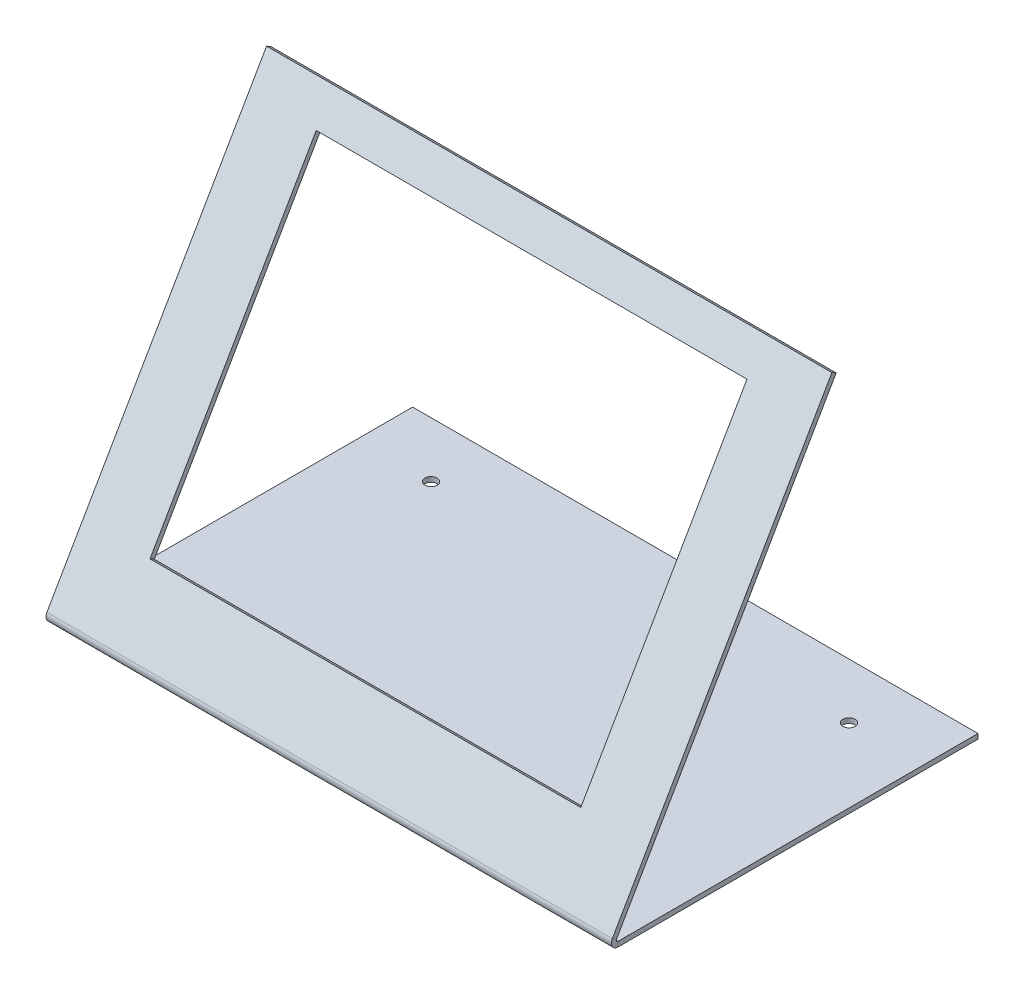
ISO-10303-21;
HEADER;
FILE_DESCRIPTION(('STEP AP214'),'2;1');
FILE_NAME('part.step','',(''),(''),'','','');
FILE_SCHEMA(('AUTOMOTIVE_DESIGN { 1 0 10303 214 1 1 1 1 }'));
ENDSEC;
DATA;
#1=APPLICATION_CONTEXT('core data for automotive mechanical design processes');
#2=APPLICATION_PROTOCOL_DEFINITION('international standard','automotive_design',2000,#1);
#3=PRODUCT_CONTEXT('',#1,'mechanical');
#4=PRODUCT('Part','Part','',(#3));
#5=PRODUCT_RELATED_PRODUCT_CATEGORY('part','',(#4));
#6=PRODUCT_DEFINITION_FORMATION('','',#4);
#7=PRODUCT_DEFINITION_CONTEXT('part definition',#1,'design');
#8=PRODUCT_DEFINITION('design','',#6,#7);
#9=PRODUCT_DEFINITION_SHAPE('','',#8);
#10=(LENGTH_UNIT() NAMED_UNIT(*) SI_UNIT(.MILLI.,.METRE.));
#11=(NAMED_UNIT(*) PLANE_ANGLE_UNIT() SI_UNIT($,.RADIAN.));
#12=(NAMED_UNIT(*) SI_UNIT($,.STERADIAN.) SOLID_ANGLE_UNIT());
#13=UNCERTAINTY_MEASURE_WITH_UNIT(LENGTH_MEASURE(1.E-05),#10,'distance_accuracy_value','');
#14=(GEOMETRIC_REPRESENTATION_CONTEXT(3) GLOBAL_UNCERTAINTY_ASSIGNED_CONTEXT((#13)) GLOBAL_UNIT_ASSIGNED_CONTEXT((#10,
#11,#12)) REPRESENTATION_CONTEXT('',''));
#15=CARTESIAN_POINT('',(0.,0.,0.));
#16=DIRECTION('',(0.,0.,1.));
#17=DIRECTION('',(1.,0.,0.));
#18=AXIS2_PLACEMENT_3D('',#15,#16,#17);
#19=CARTESIAN_POINT('',(230.,-2.,0.));
#20=DIRECTION('',(1.,0.,0.));
#21=DIRECTION('',(0.,0.,-1.));
#22=AXIS2_PLACEMENT_3D('',#19,#20,#21);
#23=PLANE('',#22);
#24=DIRECTION('',(0.,0.,-1.));
#25=VECTOR('',#24,1.);
#26=CARTESIAN_POINT('',(230.,0.,0.));
#27=LINE('',#26,#25);
#28=CARTESIAN_POINT('',(230.,0.,146.414770298386));
#29=VERTEX_POINT('',#28);
#30=CARTESIAN_POINT('',(230.,0.,0.));
#31=VERTEX_POINT('',#30);
#32=EDGE_CURVE('E324',#29,#31,#27,.T.);
#33=ORIENTED_EDGE('',*,*,#32,.F.);
#34=DIRECTION('',(0.,-1.,0.));
#35=VECTOR('',#34,1.);
#36=CARTESIAN_POINT('',(230.,0.,146.414770298386));
#37=LINE('',#36,#35);
#38=CARTESIAN_POINT('',(230.,-2.,146.414770298386));
#39=VERTEX_POINT('',#38);
#40=EDGE_CURVE('E254',#29,#39,#37,.T.);
#41=ORIENTED_EDGE('',*,*,#40,.T.);
#42=DIRECTION('',(0.,0.,-1.));
#43=VECTOR('',#42,1.);
#44=CARTESIAN_POINT('',(230.,-2.,0.));
#45=LINE('',#44,#43);
#46=CARTESIAN_POINT('',(230.,-2.,0.));
#47=VERTEX_POINT('',#46);
#48=EDGE_CURVE('E313',#39,#47,#45,.T.);
#49=ORIENTED_EDGE('',*,*,#48,.T.);
#50=DIRECTION('',(0.,1.,0.));
#51=VECTOR('',#50,1.);
#52=CARTESIAN_POINT('',(230.,-2.,0.));
#53=LINE('',#52,#51);
#54=EDGE_CURVE('E69',#47,#31,#53,.T.);
#55=ORIENTED_EDGE('',*,*,#54,.T.);
#56=EDGE_LOOP('',(#33,#41,#49,#55));
#57=FACE_BOUND('',#56,.T.);
#58=ADVANCED_FACE('F65',(#57),#23,.T.);
#59=CARTESIAN_POINT('',(0.,-2.,0.));
#60=DIRECTION('',(0.,1.,0.));
#61=DIRECTION('',(0.,0.,1.));
#62=AXIS2_PLACEMENT_3D('',#59,#60,#61);
#63=PLANE('',#62);
#64=CARTESIAN_POINT('',(30.,-2.,22.5));
#65=DIRECTION('',(0.,1.,0.));
#66=DIRECTION('',(0.,0.,1.));
#67=AXIS2_PLACEMENT_3D('',#64,#65,#66);
#68=CIRCLE('',#67,2.5);
#69=CARTESIAN_POINT('',(30.,-2.,25.));
#70=VERTEX_POINT('',#69);
#71=EDGE_CURVE('E301',#70,#70,#68,.T.);
#72=ORIENTED_EDGE('',*,*,#71,.T.);
#73=EDGE_LOOP('',(#72));
#74=FACE_BOUND('',#73,.T.);
#75=CARTESIAN_POINT('',(30.,-2.,127.5));
#76=DIRECTION('',(0.,1.,0.));
#77=DIRECTION('',(0.,0.,1.));
#78=AXIS2_PLACEMENT_3D('',#75,#76,#77);
#79=CIRCLE('',#78,2.5);
#80=CARTESIAN_POINT('',(30.,-2.,130.));
#81=VERTEX_POINT('',#80);
#82=EDGE_CURVE('E293',#81,#81,#79,.T.);
#83=ORIENTED_EDGE('',*,*,#82,.T.);
#84=EDGE_LOOP('',(#83));
#85=FACE_BOUND('',#84,.T.);
#86=CARTESIAN_POINT('',(200.,-2.,127.5));
#87=DIRECTION('',(0.,1.,0.));
#88=DIRECTION('',(0.,0.,1.));
#89=AXIS2_PLACEMENT_3D('',#86,#87,#88);
#90=CIRCLE('',#89,2.5);
#91=CARTESIAN_POINT('',(200.,-2.,130.));
#92=VERTEX_POINT('',#91);
#93=EDGE_CURVE('E285',#92,#92,#90,.T.);
#94=ORIENTED_EDGE('',*,*,#93,.T.);
#95=EDGE_LOOP('',(#94));
#96=FACE_BOUND('',#95,.T.);
#97=CARTESIAN_POINT('',(200.,-2.,22.5));
#98=DIRECTION('',(0.,1.,0.));
#99=DIRECTION('',(0.,0.,1.));
#100=AXIS2_PLACEMENT_3D('',#97,#98,#99);
#101=CIRCLE('',#100,2.5);
#102=CARTESIAN_POINT('',(200.,-2.,25.));
#103=VERTEX_POINT('',#102);
#104=EDGE_CURVE('E277',#103,#103,#101,.T.);
#105=ORIENTED_EDGE('',*,*,#104,.T.);
#106=EDGE_LOOP('',(#105));
#107=FACE_BOUND('',#106,.T.);
#108=DIRECTION('',(1.,0.,0.));
#109=VECTOR('',#108,1.);
#110=CARTESIAN_POINT('',(230.,-2.,146.414770298386));
#111=LINE('',#110,#109);
#112=CARTESIAN_POINT('',(0.,-2.,146.414770298386));
#113=VERTEX_POINT('',#112);
#114=EDGE_CURVE('E246',#39,#113,#111,.F.);
#115=ORIENTED_EDGE('',*,*,#114,.T.);
#116=DIRECTION('',(0.,0.,1.));
#117=VECTOR('',#116,1.);
#118=CARTESIAN_POINT('',(0.,-2.,0.));
#119=LINE('',#118,#117);
#120=CARTESIAN_POINT('',(0.,-2.,0.));
#121=VERTEX_POINT('',#120);
#122=EDGE_CURVE('E309',#121,#113,#119,.T.);
#123=ORIENTED_EDGE('',*,*,#122,.F.);
#124=DIRECTION('',(-1.,0.,0.));
#125=VECTOR('',#124,1.);
#126=CARTESIAN_POINT('',(0.,-2.,0.));
#127=LINE('',#126,#125);
#128=EDGE_CURVE('E317',#47,#121,#127,.T.);
#129=ORIENTED_EDGE('',*,*,#128,.F.);
#130=ORIENTED_EDGE('',*,*,#48,.F.);
#131=EDGE_LOOP('',(#115,#123,#129,#130));
#132=FACE_BOUND('',#131,.T.);
#133=ADVANCED_FACE('F383',(#74,#85,#96,#107,#132),#63,.F.);
#134=CARTESIAN_POINT('',(0.,0.,0.));
#135=DIRECTION('',(0.,1.,0.));
#136=DIRECTION('',(0.,0.,1.));
#137=AXIS2_PLACEMENT_3D('',#134,#135,#136);
#138=PLANE('',#137);
#139=CARTESIAN_POINT('',(200.,0.,22.5));
#140=DIRECTION('',(0.,1.,0.));
#141=DIRECTION('',(0.,0.,1.));
#142=AXIS2_PLACEMENT_3D('',#139,#140,#141);
#143=CIRCLE('',#142,2.5);
#144=CARTESIAN_POINT('',(200.,0.,25.));
#145=VERTEX_POINT('',#144);
#146=EDGE_CURVE('E273',#145,#145,#143,.T.);
#147=ORIENTED_EDGE('',*,*,#146,.F.);
#148=EDGE_LOOP('',(#147));
#149=FACE_BOUND('',#148,.T.);
#150=CARTESIAN_POINT('',(200.,0.,127.5));
#151=DIRECTION('',(0.,1.,0.));
#152=DIRECTION('',(0.,0.,1.));
#153=AXIS2_PLACEMENT_3D('',#150,#151,#152);
#154=CIRCLE('',#153,2.5);
#155=CARTESIAN_POINT('',(200.,0.,130.));
#156=VERTEX_POINT('',#155);
#157=EDGE_CURVE('E281',#156,#156,#154,.T.);
#158=ORIENTED_EDGE('',*,*,#157,.F.);
#159=EDGE_LOOP('',(#158));
#160=FACE_BOUND('',#159,.T.);
#161=CARTESIAN_POINT('',(30.,0.,127.5));
#162=DIRECTION('',(0.,1.,0.));
#163=DIRECTION('',(0.,0.,1.));
#164=AXIS2_PLACEMENT_3D('',#161,#162,#163);
#165=CIRCLE('',#164,2.5);
#166=CARTESIAN_POINT('',(30.,0.,130.));
#167=VERTEX_POINT('',#166);
#168=EDGE_CURVE('E289',#167,#167,#165,.T.);
#169=ORIENTED_EDGE('',*,*,#168,.F.);
#170=EDGE_LOOP('',(#169));
#171=FACE_BOUND('',#170,.T.);
#172=CARTESIAN_POINT('',(30.,0.,22.5));
#173=DIRECTION('',(0.,1.,0.));
#174=DIRECTION('',(0.,0.,1.));
#175=AXIS2_PLACEMENT_3D('',#172,#173,#174);
#176=CIRCLE('',#175,2.5);
#177=CARTESIAN_POINT('',(30.,0.,25.));
#178=VERTEX_POINT('',#177);
#179=EDGE_CURVE('E297',#178,#178,#176,.T.);
#180=ORIENTED_EDGE('',*,*,#179,.F.);
#181=EDGE_LOOP('',(#180));
#182=FACE_BOUND('',#181,.T.);
#183=DIRECTION('',(0.,0.,1.));
#184=VECTOR('',#183,1.);
#185=CARTESIAN_POINT('',(0.,0.,0.));
#186=LINE('',#185,#184);
#187=CARTESIAN_POINT('',(0.,0.,0.));
#188=VERTEX_POINT('',#187);
#189=CARTESIAN_POINT('',(0.,0.,146.414770298386));
#190=VERTEX_POINT('',#189);
#191=EDGE_CURVE('E305',#188,#190,#186,.T.);
#192=ORIENTED_EDGE('',*,*,#191,.T.);
#193=DIRECTION('',(1.,0.,0.));
#194=VECTOR('',#193,1.);
#195=CARTESIAN_POINT('',(230.,0.,146.414770298386));
#196=LINE('',#195,#194);
#197=EDGE_CURVE('E262',#29,#190,#196,.F.);
#198=ORIENTED_EDGE('',*,*,#197,.F.);
#199=ORIENTED_EDGE('',*,*,#32,.T.);
#200=DIRECTION('',(-1.,0.,0.));
#201=VECTOR('',#200,1.);
#202=CARTESIAN_POINT('',(0.,0.,0.));
#203=LINE('',#202,#201);
#204=EDGE_CURVE('E314',#31,#188,#203,.T.);
#205=ORIENTED_EDGE('',*,*,#204,.T.);
#206=EDGE_LOOP('',(#192,#198,#199,#205));
#207=FACE_BOUND('',#206,.T.);
#208=ADVANCED_FACE('F333',(#149,#160,#171,#182,#207),#138,.T.);
#209=CARTESIAN_POINT('',(0.,-2.,0.));
#210=DIRECTION('',(-1.,0.,0.));
#211=DIRECTION('',(0.,0.,1.));
#212=AXIS2_PLACEMENT_3D('',#209,#210,#211);
#213=PLANE('',#212);
#214=DIRECTION('',(0.,-1.,0.));
#215=VECTOR('',#214,1.);
#216=CARTESIAN_POINT('',(0.,0.,146.414770298386));
#217=LINE('',#216,#215);
#218=EDGE_CURVE('E269',#190,#113,#217,.T.);
#219=ORIENTED_EDGE('',*,*,#218,.F.);
#220=ORIENTED_EDGE('',*,*,#191,.F.);
#221=DIRECTION('',(0.,1.,0.));
#222=VECTOR('',#221,1.);
#223=CARTESIAN_POINT('',(0.,-2.,0.));
#224=LINE('',#223,#222);
#225=EDGE_CURVE('E13',#121,#188,#224,.T.);
#226=ORIENTED_EDGE('',*,*,#225,.F.);
#227=ORIENTED_EDGE('',*,*,#122,.T.);
#228=EDGE_LOOP('',(#219,#220,#226,#227));
#229=FACE_BOUND('',#228,.T.);
#230=ADVANCED_FACE('F67',(#229),#213,.T.);
#231=CARTESIAN_POINT('',(0.,-2.,0.));
#232=DIRECTION('',(0.,0.,-1.));
#233=DIRECTION('',(-1.,0.,0.));
#234=AXIS2_PLACEMENT_3D('',#231,#232,#233);
#235=PLANE('',#234);
#236=ORIENTED_EDGE('',*,*,#204,.F.);
#237=ORIENTED_EDGE('',*,*,#54,.F.);
#238=ORIENTED_EDGE('',*,*,#128,.T.);
#239=ORIENTED_EDGE('',*,*,#225,.T.);
#240=EDGE_LOOP('',(#236,#237,#238,#239));
#241=FACE_BOUND('',#240,.T.);
#242=ADVANCED_FACE('F339',(#241),#235,.T.);
#243=CARTESIAN_POINT('',(30.,-2.,22.5));
#244=DIRECTION('',(0.,1.,0.));
#245=DIRECTION('',(0.,0.,1.));
#246=AXIS2_PLACEMENT_3D('',#243,#244,#245);
#247=CYLINDRICAL_SURFACE('',#246,2.5);
#248=ORIENTED_EDGE('',*,*,#71,.F.);
#249=EDGE_LOOP('',(#248));
#250=FACE_BOUND('',#249,.T.);
#251=ORIENTED_EDGE('',*,*,#179,.T.);
#252=EDGE_LOOP('',(#251));
#253=FACE_BOUND('',#252,.T.);
#254=ADVANCED_FACE('F393',(#250,#253),#247,.F.);
#255=CARTESIAN_POINT('',(30.,-2.,127.5));
#256=DIRECTION('',(0.,1.,0.));
#257=DIRECTION('',(0.,0.,1.));
#258=AXIS2_PLACEMENT_3D('',#255,#256,#257);
#259=CYLINDRICAL_SURFACE('',#258,2.5);
#260=ORIENTED_EDGE('',*,*,#82,.F.);
#261=EDGE_LOOP('',(#260));
#262=FACE_BOUND('',#261,.T.);
#263=ORIENTED_EDGE('',*,*,#168,.T.);
#264=EDGE_LOOP('',(#263));
#265=FACE_BOUND('',#264,.T.);
#266=ADVANCED_FACE('F399',(#262,#265),#259,.F.);
#267=CARTESIAN_POINT('',(200.,-2.,127.5));
#268=DIRECTION('',(0.,1.,0.));
#269=DIRECTION('',(0.,0.,1.));
#270=AXIS2_PLACEMENT_3D('',#267,#268,#269);
#271=CYLINDRICAL_SURFACE('',#270,2.5);
#272=ORIENTED_EDGE('',*,*,#93,.F.);
#273=EDGE_LOOP('',(#272));
#274=FACE_BOUND('',#273,.T.);
#275=ORIENTED_EDGE('',*,*,#157,.T.);
#276=EDGE_LOOP('',(#275));
#277=FACE_BOUND('',#276,.T.);
#278=ADVANCED_FACE('F403',(#274,#277),#271,.F.);
#279=CARTESIAN_POINT('',(200.,-2.,22.5));
#280=DIRECTION('',(0.,1.,0.));
#281=DIRECTION('',(0.,0.,1.));
#282=AXIS2_PLACEMENT_3D('',#279,#280,#281);
#283=CYLINDRICAL_SURFACE('',#282,2.5);
#284=ORIENTED_EDGE('',*,*,#104,.F.);
#285=EDGE_LOOP('',(#284));
#286=FACE_BOUND('',#285,.T.);
#287=ORIENTED_EDGE('',*,*,#146,.T.);
#288=EDGE_LOOP('',(#287));
#289=FACE_BOUND('',#288,.T.);
#290=ADVANCED_FACE('F407',(#286,#289),#283,.F.);
#291=CARTESIAN_POINT('',(0.,0.736600000000015,146.414770298386));
#292=DIRECTION('',(-1.,0.,0.));
#293=DIRECTION('',(0.,0.,1.));
#294=AXIS2_PLACEMENT_3D('',#291,#292,#293);
#295=PLANE('',#294);
#296=DIRECTION('',(0.,-0.499999999999998,-0.86602540378444));
#297=VECTOR('',#296,1.);
#298=CARTESIAN_POINT('',(0.,2.10490000000001,148.784735418383));
#299=LINE('',#298,#297);
#300=CARTESIAN_POINT('',(0.,1.10490000000002,147.052684610814));
#301=VERTEX_POINT('',#300);
#302=CARTESIAN_POINT('',(0.,2.10490000000002,148.784735418383));
#303=VERTEX_POINT('',#302);
#304=EDGE_CURVE('E203',#301,#303,#299,.F.);
#305=ORIENTED_EDGE('',*,*,#304,.F.);
#306=CARTESIAN_POINT('',(0.,0.736600000000015,146.414770298386));
#307=DIRECTION('',(1.,0.,0.));
#308=DIRECTION('',(0.,0.,-1.));
#309=AXIS2_PLACEMENT_3D('',#306,#307,#308);
#310=CIRCLE('',#309,0.736600000000015);
#311=EDGE_CURVE('E258',#190,#301,#310,.F.);
#312=ORIENTED_EDGE('',*,*,#311,.F.);
#313=ORIENTED_EDGE('',*,*,#218,.T.);
#314=CARTESIAN_POINT('',(0.,0.736600000000015,146.414770298386));
#315=DIRECTION('',(1.,0.,0.));
#316=DIRECTION('',(0.,0.,-1.));
#317=AXIS2_PLACEMENT_3D('',#314,#315,#316);
#318=CIRCLE('',#317,2.73660000000001);
#319=EDGE_CURVE('E249',#113,#303,#318,.F.);
#320=ORIENTED_EDGE('',*,*,#319,.T.);
#321=EDGE_LOOP('',(#305,#312,#313,#320));
#322=FACE_BOUND('',#321,.T.);
#323=ADVANCED_FACE('F346',(#322),#295,.T.);
#324=CARTESIAN_POINT('',(230.,0.736600000000015,146.414770298386));
#325=DIRECTION('',(-1.,0.,0.));
#326=DIRECTION('',(0.,0.,1.));
#327=AXIS2_PLACEMENT_3D('',#324,#325,#326);
#328=PLANE('',#327);
#329=CARTESIAN_POINT('',(230.,0.736600000000015,146.414770298386));
#330=DIRECTION('',(1.,0.,0.));
#331=DIRECTION('',(0.,0.,-1.));
#332=AXIS2_PLACEMENT_3D('',#329,#330,#331);
#333=CIRCLE('',#332,0.736600000000015);
#334=CARTESIAN_POINT('',(230.,1.10490000000002,147.052684610814));
#335=VERTEX_POINT('',#334);
#336=EDGE_CURVE('E208',#335,#29,#333,.T.);
#337=ORIENTED_EDGE('',*,*,#336,.F.);
#338=DIRECTION('',(0.,-0.499999999999998,-0.86602540378444));
#339=VECTOR('',#338,1.);
#340=CARTESIAN_POINT('',(230.,1.10490000000002,147.052684610814));
#341=LINE('',#340,#339);
#342=CARTESIAN_POINT('',(230.,2.10490000000002,148.784735418383));
#343=VERTEX_POINT('',#342);
#344=EDGE_CURVE('E236',#335,#343,#341,.F.);
#345=ORIENTED_EDGE('',*,*,#344,.T.);
#346=CARTESIAN_POINT('',(230.,0.736600000000015,146.414770298386));
#347=DIRECTION('',(1.,0.,0.));
#348=DIRECTION('',(0.,0.,-1.));
#349=AXIS2_PLACEMENT_3D('',#346,#347,#348);
#350=CIRCLE('',#349,2.73660000000001);
#351=EDGE_CURVE('E250',#343,#39,#350,.T.);
#352=ORIENTED_EDGE('',*,*,#351,.T.);
#353=ORIENTED_EDGE('',*,*,#40,.F.);
#354=EDGE_LOOP('',(#337,#345,#352,#353));
#355=FACE_BOUND('',#354,.T.);
#356=ADVANCED_FACE('F412',(#355),#328,.F.);
#357=CARTESIAN_POINT('',(230.,0.736600000000015,146.414770298386));
#358=DIRECTION('',(1.,0.,0.));
#359=DIRECTION('',(0.,0.499999999999998,0.86602540378444));
#360=AXIS2_PLACEMENT_3D('',#357,#358,#359);
#361=CYLINDRICAL_SURFACE('',#360,2.73660000000001);
#362=ORIENTED_EDGE('',*,*,#114,.F.);
#363=ORIENTED_EDGE('',*,*,#351,.F.);
#364=DIRECTION('',(1.,0.,0.));
#365=VECTOR('',#364,1.);
#366=CARTESIAN_POINT('',(0.,2.10490000000003,148.784735418383));
#367=LINE('',#366,#365);
#368=EDGE_CURVE('E233',#343,#303,#367,.F.);
#369=ORIENTED_EDGE('',*,*,#368,.T.);
#370=ORIENTED_EDGE('',*,*,#319,.F.);
#371=EDGE_LOOP('',(#362,#363,#369,#370));
#372=FACE_BOUND('',#371,.T.);
#373=ADVANCED_FACE('F349',(#372),#361,.T.);
#374=CARTESIAN_POINT('',(230.,0.736600000000015,146.414770298386));
#375=DIRECTION('',(1.,0.,0.));
#376=DIRECTION('',(0.,0.499999999999998,0.86602540378444));
#377=AXIS2_PLACEMENT_3D('',#374,#375,#376);
#378=CYLINDRICAL_SURFACE('',#377,0.736600000000015);
#379=ORIENTED_EDGE('',*,*,#197,.T.);
#380=ORIENTED_EDGE('',*,*,#311,.T.);
#381=DIRECTION('',(1.,0.,0.));
#382=VECTOR('',#381,1.);
#383=CARTESIAN_POINT('',(0.,1.10490000000002,147.052684610814));
#384=LINE('',#383,#382);
#385=EDGE_CURVE('E240',#301,#335,#384,.T.);
#386=ORIENTED_EDGE('',*,*,#385,.T.);
#387=ORIENTED_EDGE('',*,*,#336,.T.);
#388=EDGE_LOOP('',(#379,#380,#386,#387));
#389=FACE_BOUND('',#388,.T.);
#390=ADVANCED_FACE('F370',(#389),#378,.F.);
#391=CARTESIAN_POINT('',(0.,0.999999999999996,149.42264973081));
#392=DIRECTION('',(1.,0.,0.));
#393=DIRECTION('',(0.,1.,0.));
#394=AXIS2_PLACEMENT_3D('',#391,#392,#393);
#395=PLANE('',#394);
#396=ORIENTED_EDGE('',*,*,#304,.T.);
#397=DIRECTION('',(0.,-0.86602540378444,0.499999999999998));
#398=VECTOR('',#397,1.);
#399=CARTESIAN_POINT('',(0.,65.9519052838327,111.922649730811));
#400=LINE('',#399,#398);
#401=CARTESIAN_POINT('',(0.,156.884572681199,59.4226497308108));
#402=VERTEX_POINT('',#401);
#403=EDGE_CURVE('E219',#402,#303,#400,.T.);
#404=ORIENTED_EDGE('',*,*,#403,.F.);
#405=DIRECTION('',(0.,-0.499999999999998,-0.86602540378444));
#406=VECTOR('',#405,1.);
#407=CARTESIAN_POINT('',(0.,156.884572681199,59.4226497308107));
#408=LINE('',#407,#406);
#409=CARTESIAN_POINT('',(0.,155.884572681199,57.6905989232419));
#410=VERTEX_POINT('',#409);
#411=EDGE_CURVE('E209',#402,#410,#408,.T.);
#412=ORIENTED_EDGE('',*,*,#411,.T.);
#413=DIRECTION('',(0.,0.86602540378444,-0.499999999999998));
#414=VECTOR('',#413,1.);
#415=CARTESIAN_POINT('',(0.,0.,147.690598923242));
#416=LINE('',#415,#414);
#417=EDGE_CURVE('E229',#410,#301,#416,.F.);
#418=ORIENTED_EDGE('',*,*,#417,.T.);
#419=EDGE_LOOP('',(#396,#404,#412,#418));
#420=FACE_BOUND('',#419,.T.);
#421=ADVANCED_FACE('F367',(#420),#395,.F.);
#422=CARTESIAN_POINT('',(230.,156.884572681199,59.4226497308107));
#423=DIRECTION('',(-1.,0.,0.));
#424=DIRECTION('',(0.,-1.,0.));
#425=AXIS2_PLACEMENT_3D('',#422,#423,#424);
#426=PLANE('',#425);
#427=ORIENTED_EDGE('',*,*,#344,.F.);
#428=DIRECTION('',(0.,-0.86602540378444,0.499999999999998));
#429=VECTOR('',#428,1.);
#430=CARTESIAN_POINT('',(230.,155.884572681199,57.6905989232419));
#431=LINE('',#430,#429);
#432=CARTESIAN_POINT('',(230.,155.884572681199,57.6905989232419));
#433=VERTEX_POINT('',#432);
#434=EDGE_CURVE('E226',#335,#433,#431,.F.);
#435=ORIENTED_EDGE('',*,*,#434,.T.);
#436=DIRECTION('',(0.,-0.499999999999998,-0.86602540378444));
#437=VECTOR('',#436,1.);
#438=CARTESIAN_POINT('',(230.,156.884572681199,59.4226497308107));
#439=LINE('',#438,#437);
#440=CARTESIAN_POINT('',(230.,156.884572681199,59.4226497308108));
#441=VERTEX_POINT('',#440);
#442=EDGE_CURVE('E204',#441,#433,#439,.T.);
#443=ORIENTED_EDGE('',*,*,#442,.F.);
#444=DIRECTION('',(0.,0.86602540378444,-0.499999999999998));
#445=VECTOR('',#444,1.);
#446=CARTESIAN_POINT('',(230.,65.9519052838328,111.922649730811));
#447=LINE('',#446,#445);
#448=EDGE_CURVE('E216',#343,#441,#447,.T.);
#449=ORIENTED_EDGE('',*,*,#448,.F.);
#450=EDGE_LOOP('',(#427,#435,#443,#449));
#451=FACE_BOUND('',#450,.T.);
#452=ADVANCED_FACE('F358',(#451),#426,.F.);
#453=CARTESIAN_POINT('',(0.,65.9519052838327,111.922649730811));
#454=DIRECTION('',(0.,-0.499999999999998,-0.86602540378444));
#455=DIRECTION('',(0.,0.86602540378444,-0.499999999999998));
#456=AXIS2_PLACEMENT_3D('',#453,#454,#455);
#457=PLANE('',#456);
#458=DIRECTION('',(0.,0.86602540378444,-0.499999999999998));
#459=VECTOR('',#458,1.);
#460=CARTESIAN_POINT('',(202.615,144.446641624433,66.603692574597));
#461=LINE('',#460,#459);
#462=CARTESIAN_POINT('',(202.615,27.3340262706628,134.218692574597));
#463=VERTEX_POINT('',#462);
#464=CARTESIAN_POINT('',(202.615,144.446641624433,66.603692574597));
#465=VERTEX_POINT('',#464);
#466=EDGE_CURVE('E170',#463,#465,#461,.T.);
#467=ORIENTED_EDGE('',*,*,#466,.F.);
#468=DIRECTION('',(1.,0.,0.));
#469=VECTOR('',#468,1.);
#470=CARTESIAN_POINT('',(27.385,27.3340262706628,134.218692574597));
#471=LINE('',#470,#469);
#472=CARTESIAN_POINT('',(27.385,27.3340262706628,134.218692574597));
#473=VERTEX_POINT('',#472);
#474=EDGE_CURVE('E187',#473,#463,#471,.T.);
#475=ORIENTED_EDGE('',*,*,#474,.F.);
#476=DIRECTION('',(0.,-0.86602540378444,0.499999999999998));
#477=VECTOR('',#476,1.);
#478=CARTESIAN_POINT('',(27.385,144.446641624433,66.603692574597));
#479=LINE('',#478,#477);
#480=CARTESIAN_POINT('',(27.385,144.446641624433,66.6036925745969));
#481=VERTEX_POINT('',#480);
#482=EDGE_CURVE('E184',#481,#473,#479,.T.);
#483=ORIENTED_EDGE('',*,*,#482,.F.);
#484=DIRECTION('',(-1.,0.,0.));
#485=VECTOR('',#484,1.);
#486=CARTESIAN_POINT('',(27.385,144.446641624433,66.603692574597));
#487=LINE('',#486,#485);
#488=EDGE_CURVE('E81',#465,#481,#487,.T.);
#489=ORIENTED_EDGE('',*,*,#488,.F.);
#490=EDGE_LOOP('',(#467,#475,#483,#489));
#491=FACE_BOUND('',#490,.T.);
#492=ORIENTED_EDGE('',*,*,#368,.F.);
#493=ORIENTED_EDGE('',*,*,#448,.T.);
#494=DIRECTION('',(-1.,0.,0.));
#495=VECTOR('',#494,1.);
#496=CARTESIAN_POINT('',(0.,156.884572681199,59.4226497308108));
#497=LINE('',#496,#495);
#498=EDGE_CURVE('E213',#441,#402,#497,.T.);
#499=ORIENTED_EDGE('',*,*,#498,.T.);
#500=ORIENTED_EDGE('',*,*,#403,.T.);
#501=EDGE_LOOP('',(#492,#493,#499,#500));
#502=FACE_BOUND('',#501,.T.);
#503=ADVANCED_FACE('F353',(#491,#502),#457,.F.);
#504=CARTESIAN_POINT('',(0.,64.9519052838327,110.190598923242));
#505=DIRECTION('',(0.,-0.499999999999998,-0.86602540378444));
#506=DIRECTION('',(0.,0.86602540378444,-0.499999999999998));
#507=AXIS2_PLACEMENT_3D('',#504,#505,#506);
#508=PLANE('',#507);
#509=DIRECTION('',(1.,0.,0.));
#510=VECTOR('',#509,1.);
#511=CARTESIAN_POINT('',(27.385,26.3340262706628,132.486641767028));
#512=LINE('',#511,#510);
#513=CARTESIAN_POINT('',(27.385,26.3340262706628,132.486641767028));
#514=VERTEX_POINT('',#513);
#515=CARTESIAN_POINT('',(202.615,26.3340262706628,132.486641767028));
#516=VERTEX_POINT('',#515);
#517=EDGE_CURVE('E177',#514,#516,#512,.T.);
#518=ORIENTED_EDGE('',*,*,#517,.T.);
#519=DIRECTION('',(0.,0.86602540378444,-0.499999999999998));
#520=VECTOR('',#519,1.);
#521=CARTESIAN_POINT('',(202.615,143.446641624433,64.8716417670281));
#522=LINE('',#521,#520);
#523=CARTESIAN_POINT('',(202.615,143.446641624433,64.871641767028));
#524=VERTEX_POINT('',#523);
#525=EDGE_CURVE('E164',#516,#524,#522,.T.);
#526=ORIENTED_EDGE('',*,*,#525,.T.);
#527=DIRECTION('',(-1.,0.,0.));
#528=VECTOR('',#527,1.);
#529=CARTESIAN_POINT('',(27.385,143.446641624433,64.871641767028));
#530=LINE('',#529,#528);
#531=CARTESIAN_POINT('',(27.385,143.446641624433,64.871641767028));
#532=VERTEX_POINT('',#531);
#533=EDGE_CURVE('E153',#524,#532,#530,.T.);
#534=ORIENTED_EDGE('',*,*,#533,.T.);
#535=DIRECTION('',(0.,-0.86602540378444,0.499999999999998));
#536=VECTOR('',#535,1.);
#537=CARTESIAN_POINT('',(27.385,143.446641624433,64.8716417670281));
#538=LINE('',#537,#536);
#539=EDGE_CURVE('E163',#532,#514,#538,.T.);
#540=ORIENTED_EDGE('',*,*,#539,.T.);
#541=EDGE_LOOP('',(#518,#526,#534,#540));
#542=FACE_BOUND('',#541,.T.);
#543=ORIENTED_EDGE('',*,*,#434,.F.);
#544=ORIENTED_EDGE('',*,*,#385,.F.);
#545=ORIENTED_EDGE('',*,*,#417,.F.);
#546=DIRECTION('',(1.,0.,0.));
#547=VECTOR('',#546,1.);
#548=CARTESIAN_POINT('',(0.,155.884572681199,57.6905989232419));
#549=LINE('',#548,#547);
#550=EDGE_CURVE('E223',#433,#410,#549,.F.);
#551=ORIENTED_EDGE('',*,*,#550,.F.);
#552=EDGE_LOOP('',(#543,#544,#545,#551));
#553=FACE_BOUND('',#552,.T.);
#554=ADVANCED_FACE('F175',(#542,#553),#508,.T.);
#555=CARTESIAN_POINT('',(0.,156.884572681199,59.4226497308107));
#556=DIRECTION('',(0.,-0.86602540378444,0.499999999999998));
#557=DIRECTION('',(0.,-0.499999999999998,-0.86602540378444));
#558=AXIS2_PLACEMENT_3D('',#555,#556,#557);
#559=PLANE('',#558);
#560=ORIENTED_EDGE('',*,*,#550,.T.);
#561=ORIENTED_EDGE('',*,*,#411,.F.);
#562=ORIENTED_EDGE('',*,*,#498,.F.);
#563=ORIENTED_EDGE('',*,*,#442,.T.);
#564=EDGE_LOOP('',(#560,#561,#562,#563));
#565=FACE_BOUND('',#564,.T.);
#566=ADVANCED_FACE('F364',(#565),#559,.F.);
#567=CARTESIAN_POINT('',(27.385,-38.1185620258719,20.85148415811));
#568=DIRECTION('',(0.,-0.86602540378444,0.499999999999998));
#569=DIRECTION('',(0.,-0.499999999999998,-0.86602540378444));
#570=AXIS2_PLACEMENT_3D('',#567,#568,#569);
#571=PLANE('',#570);
#572=DIRECTION('',(0.,0.499999999999998,0.86602540378444));
#573=VECTOR('',#572,1.);
#574=CARTESIAN_POINT('',(27.385,-38.1185620258719,20.85148415811));
#575=LINE('',#574,#573);
#576=EDGE_CURVE('E89',#514,#473,#575,.T.);
#577=ORIENTED_EDGE('',*,*,#576,.T.);
#578=ORIENTED_EDGE('',*,*,#474,.T.);
#579=DIRECTION('',(0.,0.499999999999998,0.86602540378444));
#580=VECTOR('',#579,1.);
#581=CARTESIAN_POINT('',(202.615,-38.1185620258719,20.85148415811));
#582=LINE('',#581,#580);
#583=EDGE_CURVE('E172',#516,#463,#582,.T.);
#584=ORIENTED_EDGE('',*,*,#583,.F.);
#585=ORIENTED_EDGE('',*,*,#517,.F.);
#586=EDGE_LOOP('',(#577,#578,#584,#585));
#587=FACE_BOUND('',#586,.T.);
#588=ADVANCED_FACE('F378',(#587),#571,.F.);
#589=CARTESIAN_POINT('',(202.615,78.9940533278979,-46.7635158418897));
#590=DIRECTION('',(1.,0.,0.));
#591=DIRECTION('',(0.,1.,0.));
#592=AXIS2_PLACEMENT_3D('',#589,#590,#591);
#593=PLANE('',#592);
#594=ORIENTED_EDGE('',*,*,#583,.T.);
#595=ORIENTED_EDGE('',*,*,#466,.T.);
#596=DIRECTION('',(0.,0.499999999999998,0.86602540378444));
#597=VECTOR('',#596,1.);
#598=CARTESIAN_POINT('',(202.615,78.9940533278979,-46.7635158418897));
#599=LINE('',#598,#597);
#600=EDGE_CURVE('E156',#524,#465,#599,.T.);
#601=ORIENTED_EDGE('',*,*,#600,.F.);
#602=ORIENTED_EDGE('',*,*,#525,.F.);
#603=EDGE_LOOP('',(#594,#595,#601,#602));
#604=FACE_BOUND('',#603,.T.);
#605=ADVANCED_FACE('F167',(#604),#593,.F.);
#606=CARTESIAN_POINT('',(27.385,78.9940533278979,-46.7635158418897));
#607=DIRECTION('',(0.,0.86602540378444,-0.499999999999998));
#608=DIRECTION('',(0.,0.499999999999998,0.86602540378444));
#609=AXIS2_PLACEMENT_3D('',#606,#607,#608);
#610=PLANE('',#609);
#611=ORIENTED_EDGE('',*,*,#600,.T.);
#612=ORIENTED_EDGE('',*,*,#488,.T.);
#613=DIRECTION('',(0.,0.499999999999998,0.86602540378444));
#614=VECTOR('',#613,1.);
#615=CARTESIAN_POINT('',(27.385,78.9940533278979,-46.7635158418897));
#616=LINE('',#615,#614);
#617=EDGE_CURVE('E158',#532,#481,#616,.T.);
#618=ORIENTED_EDGE('',*,*,#617,.F.);
#619=ORIENTED_EDGE('',*,*,#533,.F.);
#620=EDGE_LOOP('',(#611,#612,#618,#619));
#621=FACE_BOUND('',#620,.T.);
#622=ADVANCED_FACE('F155',(#621),#610,.F.);
#623=CARTESIAN_POINT('',(27.385,78.9940533278979,-46.7635158418897));
#624=DIRECTION('',(-1.,0.,0.));
#625=DIRECTION('',(0.,-1.,0.));
#626=AXIS2_PLACEMENT_3D('',#623,#624,#625);
#627=PLANE('',#626);
#628=ORIENTED_EDGE('',*,*,#617,.T.);
#629=ORIENTED_EDGE('',*,*,#482,.T.);
#630=ORIENTED_EDGE('',*,*,#576,.F.);
#631=ORIENTED_EDGE('',*,*,#539,.F.);
#632=EDGE_LOOP('',(#628,#629,#630,#631));
#633=FACE_BOUND('',#632,.T.);
#634=ADVANCED_FACE('F474',(#633),#627,.F.);
#635=CLOSED_SHELL('',(#58,#133,#208,#230,#242,#254,#266,#278,#290,#323,#356,#373,#390,#421,#452,
#503,#554,#566,#588,#605,#622,#634));
#636=MANIFOLD_SOLID_BREP('B2',#635);
#637=ADVANCED_BREP_SHAPE_REPRESENTATION('',(#18,#636),#14);
#638=SHAPE_DEFINITION_REPRESENTATION(#9,#637);
ENDSEC;
END-ISO-10303-21;
